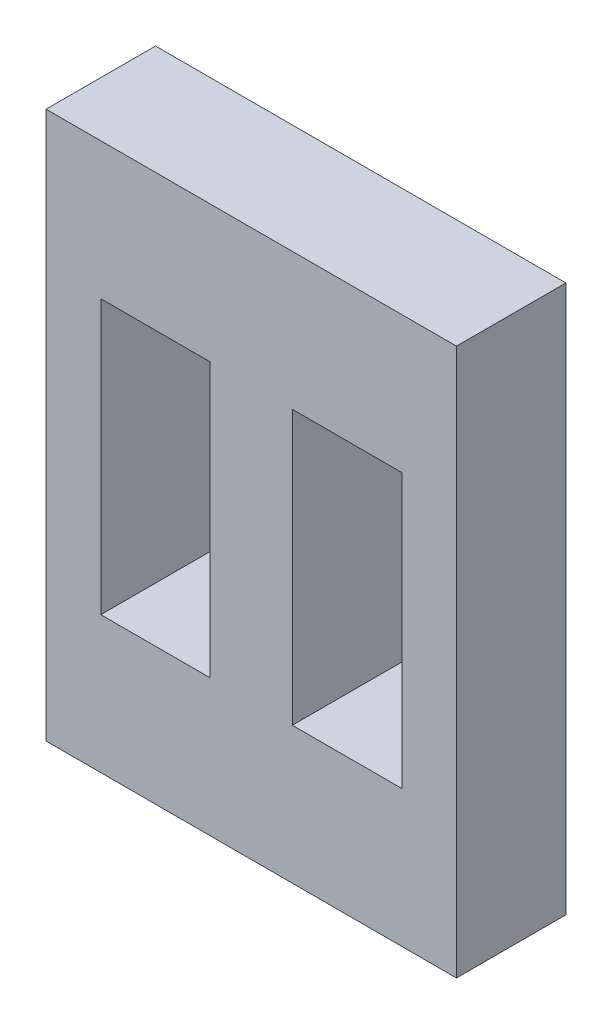
ISO-10303-21;
HEADER;
FILE_DESCRIPTION(('STEP AP214'),'2;1');
FILE_NAME('part.step','',(''),(''),'','','');
FILE_SCHEMA(('AUTOMOTIVE_DESIGN { 1 0 10303 214 1 1 1 1 }'));
ENDSEC;
DATA;
#1=APPLICATION_CONTEXT('core data for automotive mechanical design processes');
#2=APPLICATION_PROTOCOL_DEFINITION('international standard','automotive_design',2000,#1);
#3=PRODUCT_CONTEXT('',#1,'mechanical');
#4=PRODUCT('Part','Part','',(#3));
#5=PRODUCT_RELATED_PRODUCT_CATEGORY('part','',(#4));
#6=PRODUCT_DEFINITION_FORMATION('','',#4);
#7=PRODUCT_DEFINITION_CONTEXT('part definition',#1,'design');
#8=PRODUCT_DEFINITION('design','',#6,#7);
#9=PRODUCT_DEFINITION_SHAPE('','',#8);
#10=(LENGTH_UNIT() NAMED_UNIT(*) SI_UNIT(.MILLI.,.METRE.));
#11=(NAMED_UNIT(*) PLANE_ANGLE_UNIT() SI_UNIT($,.RADIAN.));
#12=(NAMED_UNIT(*) SI_UNIT($,.STERADIAN.) SOLID_ANGLE_UNIT());
#13=UNCERTAINTY_MEASURE_WITH_UNIT(LENGTH_MEASURE(1.E-05),#10,'distance_accuracy_value','');
#14=(GEOMETRIC_REPRESENTATION_CONTEXT(3) GLOBAL_UNCERTAINTY_ASSIGNED_CONTEXT((#13)) GLOBAL_UNIT_ASSIGNED_CONTEXT((#10,
#11,#12)) REPRESENTATION_CONTEXT('',''));
#15=CARTESIAN_POINT('',(0.,0.,0.));
#16=DIRECTION('',(0.,0.,1.));
#17=DIRECTION('',(1.,0.,0.));
#18=AXIS2_PLACEMENT_3D('',#15,#16,#17);
#19=CARTESIAN_POINT('',(0.,0.,2.));
#20=DIRECTION('',(0.,0.,-1.));
#21=DIRECTION('',(-1.,0.,0.));
#22=AXIS2_PLACEMENT_3D('',#19,#20,#21);
#23=PLANE('',#22);
#24=DIRECTION('',(0.,-1.,0.));
#25=VECTOR('',#24,1.);
#26=CARTESIAN_POINT('',(-43.,15.,2.));
#27=LINE('',#26,#25);
#28=CARTESIAN_POINT('',(-43.,15.,2.));
#29=VERTEX_POINT('',#28);
#30=CARTESIAN_POINT('',(-43.,5.,2.));
#31=VERTEX_POINT('',#30);
#32=EDGE_CURVE('E159',#29,#31,#27,.T.);
#33=ORIENTED_EDGE('',*,*,#32,.F.);
#34=DIRECTION('',(-1.,0.,0.));
#35=VECTOR('',#34,1.);
#36=CARTESIAN_POINT('',(-43.,15.,2.));
#37=LINE('',#36,#35);
#38=CARTESIAN_POINT('',(-39.,15.,2.));
#39=VERTEX_POINT('',#38);
#40=EDGE_CURVE('E167',#39,#29,#37,.T.);
#41=ORIENTED_EDGE('',*,*,#40,.F.);
#42=DIRECTION('',(0.,1.,0.));
#43=VECTOR('',#42,1.);
#44=CARTESIAN_POINT('',(-39.,15.,2.));
#45=LINE('',#44,#43);
#46=CARTESIAN_POINT('',(-39.,5.,2.));
#47=VERTEX_POINT('',#46);
#48=EDGE_CURVE('E164',#47,#39,#45,.T.);
#49=ORIENTED_EDGE('',*,*,#48,.F.);
#50=DIRECTION('',(1.,0.,0.));
#51=VECTOR('',#50,1.);
#52=CARTESIAN_POINT('',(-43.,5.,2.));
#53=LINE('',#52,#51);
#54=EDGE_CURVE('E161',#31,#47,#53,.T.);
#55=ORIENTED_EDGE('',*,*,#54,.F.);
#56=EDGE_LOOP('',(#33,#41,#49,#55));
#57=FACE_BOUND('',#56,.T.);
#58=DIRECTION('',(1.,0.,0.));
#59=VECTOR('',#58,1.);
#60=CARTESIAN_POINT('',(-46.,0.,2.));
#61=LINE('',#60,#59);
#62=CARTESIAN_POINT('',(-52.,0.,2.));
#63=VERTEX_POINT('',#62);
#64=CARTESIAN_POINT('',(-37.,0.,2.));
#65=VERTEX_POINT('',#64);
#66=EDGE_CURVE('E190',#63,#65,#61,.T.);
#67=ORIENTED_EDGE('',*,*,#66,.T.);
#68=DIRECTION('',(0.,1.,0.));
#69=VECTOR('',#68,1.);
#70=CARTESIAN_POINT('',(-37.,20.,2.));
#71=LINE('',#70,#69);
#72=CARTESIAN_POINT('',(-37.,20.,2.));
#73=VERTEX_POINT('',#72);
#74=EDGE_CURVE('E192',#65,#73,#71,.T.);
#75=ORIENTED_EDGE('',*,*,#74,.T.);
#76=DIRECTION('',(-1.,0.,0.));
#77=VECTOR('',#76,1.);
#78=CARTESIAN_POINT('',(-46.,20.,2.));
#79=LINE('',#78,#77);
#80=CARTESIAN_POINT('',(-52.,20.,2.));
#81=VERTEX_POINT('',#80);
#82=EDGE_CURVE('E195',#73,#81,#79,.T.);
#83=ORIENTED_EDGE('',*,*,#82,.T.);
#84=DIRECTION('',(0.,-1.,0.));
#85=VECTOR('',#84,1.);
#86=CARTESIAN_POINT('',(-52.,0.,2.));
#87=LINE('',#86,#85);
#88=EDGE_CURVE('E197',#81,#63,#87,.T.);
#89=ORIENTED_EDGE('',*,*,#88,.T.);
#90=EDGE_LOOP('',(#67,#75,#83,#89));
#91=FACE_BOUND('',#90,.T.);
#92=DIRECTION('',(0.,1.,0.));
#93=VECTOR('',#92,1.);
#94=CARTESIAN_POINT('',(-46.,15.,2.));
#95=LINE('',#94,#93);
#96=CARTESIAN_POINT('',(-46.,5.,2.));
#97=VERTEX_POINT('',#96);
#98=CARTESIAN_POINT('',(-46.,15.,2.));
#99=VERTEX_POINT('',#98);
#100=EDGE_CURVE('E123',#97,#99,#95,.T.);
#101=ORIENTED_EDGE('',*,*,#100,.F.);
#102=DIRECTION('',(1.,0.,0.));
#103=VECTOR('',#102,1.);
#104=CARTESIAN_POINT('',(-46.,5.,2.));
#105=LINE('',#104,#103);
#106=CARTESIAN_POINT('',(-50.,5.,2.));
#107=VERTEX_POINT('',#106);
#108=EDGE_CURVE('E145',#107,#97,#105,.T.);
#109=ORIENTED_EDGE('',*,*,#108,.F.);
#110=DIRECTION('',(0.,-1.,0.));
#111=VECTOR('',#110,1.);
#112=CARTESIAN_POINT('',(-50.,15.,2.));
#113=LINE('',#112,#111);
#114=CARTESIAN_POINT('',(-50.,15.,2.));
#115=VERTEX_POINT('',#114);
#116=EDGE_CURVE('E143',#115,#107,#113,.T.);
#117=ORIENTED_EDGE('',*,*,#116,.F.);
#118=DIRECTION('',(-1.,0.,0.));
#119=VECTOR('',#118,1.);
#120=CARTESIAN_POINT('',(-46.,15.,2.));
#121=LINE('',#120,#119);
#122=EDGE_CURVE('E131',#99,#115,#121,.T.);
#123=ORIENTED_EDGE('',*,*,#122,.F.);
#124=EDGE_LOOP('',(#101,#109,#117,#123));
#125=FACE_BOUND('',#124,.T.);
#126=ADVANCED_FACE('F34',(#57,#91,#125),#23,.F.);
#127=CARTESIAN_POINT('',(0.,0.,-2.));
#128=DIRECTION('',(0.,0.,-1.));
#129=DIRECTION('',(-1.,0.,0.));
#130=AXIS2_PLACEMENT_3D('',#127,#128,#129);
#131=PLANE('',#130);
#132=DIRECTION('',(1.,0.,0.));
#133=VECTOR('',#132,1.);
#134=CARTESIAN_POINT('',(-46.,0.,-2.));
#135=LINE('',#134,#133);
#136=CARTESIAN_POINT('',(-52.,0.,-2.));
#137=VERTEX_POINT('',#136);
#138=CARTESIAN_POINT('',(-37.,0.,-2.));
#139=VERTEX_POINT('',#138);
#140=EDGE_CURVE('E189',#137,#139,#135,.T.);
#141=ORIENTED_EDGE('',*,*,#140,.F.);
#142=DIRECTION('',(0.,-1.,0.));
#143=VECTOR('',#142,1.);
#144=CARTESIAN_POINT('',(-52.,0.,-2.));
#145=LINE('',#144,#143);
#146=CARTESIAN_POINT('',(-52.,20.,-2.));
#147=VERTEX_POINT('',#146);
#148=EDGE_CURVE('E193',#147,#137,#145,.T.);
#149=ORIENTED_EDGE('',*,*,#148,.F.);
#150=DIRECTION('',(-1.,0.,0.));
#151=VECTOR('',#150,1.);
#152=CARTESIAN_POINT('',(-46.,20.,-2.));
#153=LINE('',#152,#151);
#154=CARTESIAN_POINT('',(-37.,20.,-2.));
#155=VERTEX_POINT('',#154);
#156=EDGE_CURVE('E204',#155,#147,#153,.T.);
#157=ORIENTED_EDGE('',*,*,#156,.F.);
#158=DIRECTION('',(0.,1.,0.));
#159=VECTOR('',#158,1.);
#160=CARTESIAN_POINT('',(-37.,20.,-2.));
#161=LINE('',#160,#159);
#162=EDGE_CURVE('E201',#139,#155,#161,.T.);
#163=ORIENTED_EDGE('',*,*,#162,.F.);
#164=EDGE_LOOP('',(#141,#149,#157,#163));
#165=FACE_BOUND('',#164,.T.);
#166=DIRECTION('',(-1.,0.,0.));
#167=VECTOR('',#166,1.);
#168=CARTESIAN_POINT('',(-43.,15.,-2.));
#169=LINE('',#168,#167);
#170=CARTESIAN_POINT('',(-39.,15.,-2.));
#171=VERTEX_POINT('',#170);
#172=CARTESIAN_POINT('',(-43.,15.,-2.));
#173=VERTEX_POINT('',#172);
#174=EDGE_CURVE('E162',#171,#173,#169,.T.);
#175=ORIENTED_EDGE('',*,*,#174,.T.);
#176=DIRECTION('',(0.,-1.,0.));
#177=VECTOR('',#176,1.);
#178=CARTESIAN_POINT('',(-43.,15.,-2.));
#179=LINE('',#178,#177);
#180=CARTESIAN_POINT('',(-43.,5.,-2.));
#181=VERTEX_POINT('',#180);
#182=EDGE_CURVE('E139',#173,#181,#179,.T.);
#183=ORIENTED_EDGE('',*,*,#182,.T.);
#184=DIRECTION('',(1.,0.,0.));
#185=VECTOR('',#184,1.);
#186=CARTESIAN_POINT('',(-43.,5.,-2.));
#187=LINE('',#186,#185);
#188=CARTESIAN_POINT('',(-39.,5.,-2.));
#189=VERTEX_POINT('',#188);
#190=EDGE_CURVE('E172',#181,#189,#187,.T.);
#191=ORIENTED_EDGE('',*,*,#190,.T.);
#192=DIRECTION('',(0.,1.,0.));
#193=VECTOR('',#192,1.);
#194=CARTESIAN_POINT('',(-39.,15.,-2.));
#195=LINE('',#194,#193);
#196=EDGE_CURVE('E175',#189,#171,#195,.T.);
#197=ORIENTED_EDGE('',*,*,#196,.T.);
#198=EDGE_LOOP('',(#175,#183,#191,#197));
#199=FACE_BOUND('',#198,.T.);
#200=DIRECTION('',(1.,0.,0.));
#201=VECTOR('',#200,1.);
#202=CARTESIAN_POINT('',(-46.,5.,-2.));
#203=LINE('',#202,#201);
#204=CARTESIAN_POINT('',(-50.,5.,-2.));
#205=VERTEX_POINT('',#204);
#206=CARTESIAN_POINT('',(-46.,5.,-2.));
#207=VERTEX_POINT('',#206);
#208=EDGE_CURVE('E132',#205,#207,#203,.T.);
#209=ORIENTED_EDGE('',*,*,#208,.T.);
#210=DIRECTION('',(0.,1.,0.));
#211=VECTOR('',#210,1.);
#212=CARTESIAN_POINT('',(-46.,15.,-2.));
#213=LINE('',#212,#211);
#214=CARTESIAN_POINT('',(-46.,15.,-2.));
#215=VERTEX_POINT('',#214);
#216=EDGE_CURVE('E57',#207,#215,#213,.T.);
#217=ORIENTED_EDGE('',*,*,#216,.T.);
#218=DIRECTION('',(-1.,0.,0.));
#219=VECTOR('',#218,1.);
#220=CARTESIAN_POINT('',(-46.,15.,-2.));
#221=LINE('',#220,#219);
#222=CARTESIAN_POINT('',(-50.,15.,-2.));
#223=VERTEX_POINT('',#222);
#224=EDGE_CURVE('E138',#215,#223,#221,.T.);
#225=ORIENTED_EDGE('',*,*,#224,.T.);
#226=DIRECTION('',(0.,-1.,0.));
#227=VECTOR('',#226,1.);
#228=CARTESIAN_POINT('',(-50.,15.,-2.));
#229=LINE('',#228,#227);
#230=EDGE_CURVE('E151',#223,#205,#229,.T.);
#231=ORIENTED_EDGE('',*,*,#230,.T.);
#232=EDGE_LOOP('',(#209,#217,#225,#231));
#233=FACE_BOUND('',#232,.T.);
#234=ADVANCED_FACE('F224',(#165,#199,#233),#131,.T.);
#235=CARTESIAN_POINT('',(-46.,0.,2.));
#236=DIRECTION('',(0.,1.,0.));
#237=DIRECTION('',(0.,0.,1.));
#238=AXIS2_PLACEMENT_3D('',#235,#236,#237);
#239=PLANE('',#238);
#240=ORIENTED_EDGE('',*,*,#140,.T.);
#241=DIRECTION('',(0.,0.,-1.));
#242=VECTOR('',#241,1.);
#243=CARTESIAN_POINT('',(-37.,0.,2.));
#244=LINE('',#243,#242);
#245=EDGE_CURVE('E11',#65,#139,#244,.T.);
#246=ORIENTED_EDGE('',*,*,#245,.F.);
#247=ORIENTED_EDGE('',*,*,#66,.F.);
#248=DIRECTION('',(0.,0.,-1.));
#249=VECTOR('',#248,1.);
#250=CARTESIAN_POINT('',(-52.,0.,2.));
#251=LINE('',#250,#249);
#252=EDGE_CURVE('E199',#63,#137,#251,.T.);
#253=ORIENTED_EDGE('',*,*,#252,.T.);
#254=EDGE_LOOP('',(#240,#246,#247,#253));
#255=FACE_BOUND('',#254,.T.);
#256=ADVANCED_FACE('F36',(#255),#239,.F.);
#257=CARTESIAN_POINT('',(-37.,20.,2.));
#258=DIRECTION('',(-1.,0.,0.));
#259=DIRECTION('',(0.,0.,1.));
#260=AXIS2_PLACEMENT_3D('',#257,#258,#259);
#261=PLANE('',#260);
#262=ORIENTED_EDGE('',*,*,#162,.T.);
#263=DIRECTION('',(0.,0.,-1.));
#264=VECTOR('',#263,1.);
#265=CARTESIAN_POINT('',(-37.,20.,2.));
#266=LINE('',#265,#264);
#267=EDGE_CURVE('E42',#73,#155,#266,.T.);
#268=ORIENTED_EDGE('',*,*,#267,.F.);
#269=ORIENTED_EDGE('',*,*,#74,.F.);
#270=ORIENTED_EDGE('',*,*,#245,.T.);
#271=EDGE_LOOP('',(#262,#268,#269,#270));
#272=FACE_BOUND('',#271,.T.);
#273=ADVANCED_FACE('F220',(#272),#261,.F.);
#274=CARTESIAN_POINT('',(-46.,20.,2.));
#275=DIRECTION('',(0.,-1.,0.));
#276=DIRECTION('',(0.,0.,-1.));
#277=AXIS2_PLACEMENT_3D('',#274,#275,#276);
#278=PLANE('',#277);
#279=ORIENTED_EDGE('',*,*,#156,.T.);
#280=DIRECTION('',(0.,0.,-1.));
#281=VECTOR('',#280,1.);
#282=CARTESIAN_POINT('',(-52.,20.,2.));
#283=LINE('',#282,#281);
#284=EDGE_CURVE('E210',#81,#147,#283,.T.);
#285=ORIENTED_EDGE('',*,*,#284,.F.);
#286=ORIENTED_EDGE('',*,*,#82,.F.);
#287=ORIENTED_EDGE('',*,*,#267,.T.);
#288=EDGE_LOOP('',(#279,#285,#286,#287));
#289=FACE_BOUND('',#288,.T.);
#290=ADVANCED_FACE('F216',(#289),#278,.F.);
#291=CARTESIAN_POINT('',(-52.,0.,2.));
#292=DIRECTION('',(1.,0.,0.));
#293=DIRECTION('',(0.,0.,-1.));
#294=AXIS2_PLACEMENT_3D('',#291,#292,#293);
#295=PLANE('',#294);
#296=ORIENTED_EDGE('',*,*,#148,.T.);
#297=ORIENTED_EDGE('',*,*,#252,.F.);
#298=ORIENTED_EDGE('',*,*,#88,.F.);
#299=ORIENTED_EDGE('',*,*,#284,.T.);
#300=EDGE_LOOP('',(#296,#297,#298,#299));
#301=FACE_BOUND('',#300,.T.);
#302=ADVANCED_FACE('F229',(#301),#295,.F.);
#303=CARTESIAN_POINT('',(-43.,15.,2.));
#304=DIRECTION('',(1.,0.,0.));
#305=DIRECTION('',(0.,0.,-1.));
#306=AXIS2_PLACEMENT_3D('',#303,#304,#305);
#307=PLANE('',#306);
#308=ORIENTED_EDGE('',*,*,#182,.F.);
#309=DIRECTION('',(0.,0.,-1.));
#310=VECTOR('',#309,1.);
#311=CARTESIAN_POINT('',(-43.,15.,2.));
#312=LINE('',#311,#310);
#313=EDGE_CURVE('E169',#29,#173,#312,.T.);
#314=ORIENTED_EDGE('',*,*,#313,.F.);
#315=ORIENTED_EDGE('',*,*,#32,.T.);
#316=DIRECTION('',(0.,0.,-1.));
#317=VECTOR('',#316,1.);
#318=CARTESIAN_POINT('',(-43.,5.,2.));
#319=LINE('',#318,#317);
#320=EDGE_CURVE('E186',#31,#181,#319,.T.);
#321=ORIENTED_EDGE('',*,*,#320,.T.);
#322=EDGE_LOOP('',(#308,#314,#315,#321));
#323=FACE_BOUND('',#322,.T.);
#324=ADVANCED_FACE('F243',(#323),#307,.T.);
#325=CARTESIAN_POINT('',(-43.,5.,2.));
#326=DIRECTION('',(0.,1.,0.));
#327=DIRECTION('',(0.,0.,1.));
#328=AXIS2_PLACEMENT_3D('',#325,#326,#327);
#329=PLANE('',#328);
#330=ORIENTED_EDGE('',*,*,#190,.F.);
#331=ORIENTED_EDGE('',*,*,#320,.F.);
#332=ORIENTED_EDGE('',*,*,#54,.T.);
#333=DIRECTION('',(0.,0.,-1.));
#334=VECTOR('',#333,1.);
#335=CARTESIAN_POINT('',(-39.,5.,2.));
#336=LINE('',#335,#334);
#337=EDGE_CURVE('E184',#47,#189,#336,.T.);
#338=ORIENTED_EDGE('',*,*,#337,.T.);
#339=EDGE_LOOP('',(#330,#331,#332,#338));
#340=FACE_BOUND('',#339,.T.);
#341=ADVANCED_FACE('F295',(#340),#329,.T.);
#342=CARTESIAN_POINT('',(-39.,15.,2.));
#343=DIRECTION('',(-1.,0.,0.));
#344=DIRECTION('',(0.,0.,1.));
#345=AXIS2_PLACEMENT_3D('',#342,#343,#344);
#346=PLANE('',#345);
#347=ORIENTED_EDGE('',*,*,#196,.F.);
#348=ORIENTED_EDGE('',*,*,#337,.F.);
#349=ORIENTED_EDGE('',*,*,#48,.T.);
#350=DIRECTION('',(0.,0.,-1.));
#351=VECTOR('',#350,1.);
#352=CARTESIAN_POINT('',(-39.,15.,2.));
#353=LINE('',#352,#351);
#354=EDGE_CURVE('E182',#39,#171,#353,.T.);
#355=ORIENTED_EDGE('',*,*,#354,.T.);
#356=EDGE_LOOP('',(#347,#348,#349,#355));
#357=FACE_BOUND('',#356,.T.);
#358=ADVANCED_FACE('F303',(#357),#346,.T.);
#359=CARTESIAN_POINT('',(-43.,15.,2.));
#360=DIRECTION('',(0.,-1.,0.));
#361=DIRECTION('',(0.,0.,-1.));
#362=AXIS2_PLACEMENT_3D('',#359,#360,#361);
#363=PLANE('',#362);
#364=ORIENTED_EDGE('',*,*,#174,.F.);
#365=ORIENTED_EDGE('',*,*,#354,.F.);
#366=ORIENTED_EDGE('',*,*,#40,.T.);
#367=ORIENTED_EDGE('',*,*,#313,.T.);
#368=EDGE_LOOP('',(#364,#365,#366,#367));
#369=FACE_BOUND('',#368,.T.);
#370=ADVANCED_FACE('F311',(#369),#363,.T.);
#371=CARTESIAN_POINT('',(-46.,15.,2.));
#372=DIRECTION('',(-1.,0.,0.));
#373=DIRECTION('',(0.,0.,1.));
#374=AXIS2_PLACEMENT_3D('',#371,#372,#373);
#375=PLANE('',#374);
#376=ORIENTED_EDGE('',*,*,#216,.F.);
#377=DIRECTION('',(0.,0.,-1.));
#378=VECTOR('',#377,1.);
#379=CARTESIAN_POINT('',(-46.,5.,2.));
#380=LINE('',#379,#378);
#381=EDGE_CURVE('E127',#97,#207,#380,.T.);
#382=ORIENTED_EDGE('',*,*,#381,.F.);
#383=ORIENTED_EDGE('',*,*,#100,.T.);
#384=DIRECTION('',(0.,0.,-1.));
#385=VECTOR('',#384,1.);
#386=CARTESIAN_POINT('',(-46.,15.,2.));
#387=LINE('',#386,#385);
#388=EDGE_CURVE('E126',#99,#215,#387,.T.);
#389=ORIENTED_EDGE('',*,*,#388,.T.);
#390=EDGE_LOOP('',(#376,#382,#383,#389));
#391=FACE_BOUND('',#390,.T.);
#392=ADVANCED_FACE('F125',(#391),#375,.T.);
#393=CARTESIAN_POINT('',(-46.,15.,2.));
#394=DIRECTION('',(0.,-1.,0.));
#395=DIRECTION('',(0.,0.,-1.));
#396=AXIS2_PLACEMENT_3D('',#393,#394,#395);
#397=PLANE('',#396);
#398=ORIENTED_EDGE('',*,*,#224,.F.);
#399=ORIENTED_EDGE('',*,*,#388,.F.);
#400=ORIENTED_EDGE('',*,*,#122,.T.);
#401=DIRECTION('',(0.,0.,-1.));
#402=VECTOR('',#401,1.);
#403=CARTESIAN_POINT('',(-50.,15.,2.));
#404=LINE('',#403,#402);
#405=EDGE_CURVE('E140',#115,#223,#404,.T.);
#406=ORIENTED_EDGE('',*,*,#405,.T.);
#407=EDGE_LOOP('',(#398,#399,#400,#406));
#408=FACE_BOUND('',#407,.T.);
#409=ADVANCED_FACE('F135',(#408),#397,.T.);
#410=CARTESIAN_POINT('',(-50.,15.,2.));
#411=DIRECTION('',(1.,0.,0.));
#412=DIRECTION('',(0.,0.,-1.));
#413=AXIS2_PLACEMENT_3D('',#410,#411,#412);
#414=PLANE('',#413);
#415=ORIENTED_EDGE('',*,*,#230,.F.);
#416=ORIENTED_EDGE('',*,*,#405,.F.);
#417=ORIENTED_EDGE('',*,*,#116,.T.);
#418=DIRECTION('',(0.,0.,-1.));
#419=VECTOR('',#418,1.);
#420=CARTESIAN_POINT('',(-50.,5.,2.));
#421=LINE('',#420,#419);
#422=EDGE_CURVE('E49',#107,#205,#421,.T.);
#423=ORIENTED_EDGE('',*,*,#422,.T.);
#424=EDGE_LOOP('',(#415,#416,#417,#423));
#425=FACE_BOUND('',#424,.T.);
#426=ADVANCED_FACE('F335',(#425),#414,.T.);
#427=CARTESIAN_POINT('',(-46.,5.,2.));
#428=DIRECTION('',(0.,1.,0.));
#429=DIRECTION('',(0.,0.,1.));
#430=AXIS2_PLACEMENT_3D('',#427,#428,#429);
#431=PLANE('',#430);
#432=ORIENTED_EDGE('',*,*,#208,.F.);
#433=ORIENTED_EDGE('',*,*,#422,.F.);
#434=ORIENTED_EDGE('',*,*,#108,.T.);
#435=ORIENTED_EDGE('',*,*,#381,.T.);
#436=EDGE_LOOP('',(#432,#433,#434,#435));
#437=FACE_BOUND('',#436,.T.);
#438=ADVANCED_FACE('F343',(#437),#431,.T.);
#439=CLOSED_SHELL('',(#126,#234,#256,#273,#290,#302,#324,#341,#358,#370,#392,#409,#426,#438));
#440=MANIFOLD_SOLID_BREP('B2',#439);
#441=ADVANCED_BREP_SHAPE_REPRESENTATION('',(#18,#440),#14);
#442=SHAPE_DEFINITION_REPRESENTATION(#9,#441);
ENDSEC;
END-ISO-10303-21;
